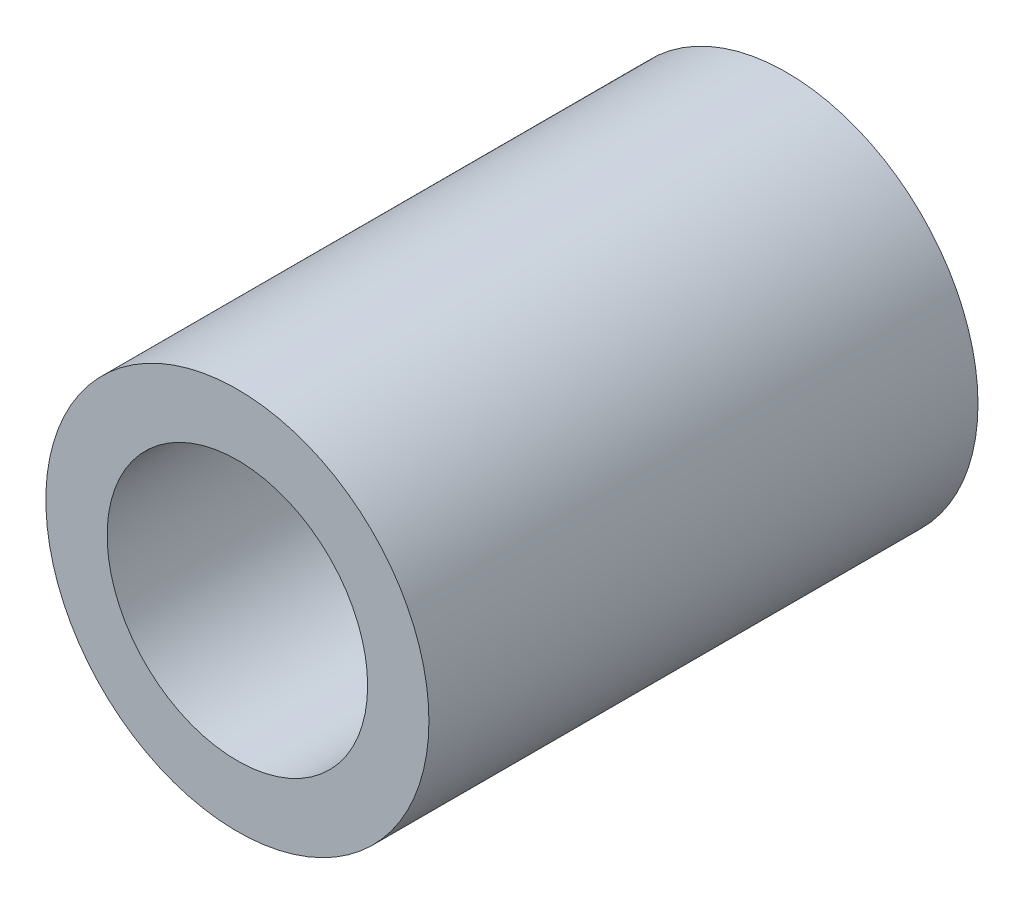
ISO-10303-21;
HEADER;
FILE_DESCRIPTION(('STEP AP214'),'2;1');
FILE_NAME('part.step','',(''),(''),'','','');
FILE_SCHEMA(('AUTOMOTIVE_DESIGN { 1 0 10303 214 1 1 1 1 }'));
ENDSEC;
DATA;
#1=APPLICATION_CONTEXT('core data for automotive mechanical design processes');
#2=APPLICATION_PROTOCOL_DEFINITION('international standard','automotive_design',2000,#1);
#3=PRODUCT_CONTEXT('',#1,'mechanical');
#4=PRODUCT('Part','Part','',(#3));
#5=PRODUCT_RELATED_PRODUCT_CATEGORY('part','',(#4));
#6=PRODUCT_DEFINITION_FORMATION('','',#4);
#7=PRODUCT_DEFINITION_CONTEXT('part definition',#1,'design');
#8=PRODUCT_DEFINITION('design','',#6,#7);
#9=PRODUCT_DEFINITION_SHAPE('','',#8);
#10=(LENGTH_UNIT() NAMED_UNIT(*) SI_UNIT(.MILLI.,.METRE.));
#11=(NAMED_UNIT(*) PLANE_ANGLE_UNIT() SI_UNIT($,.RADIAN.));
#12=(NAMED_UNIT(*) SI_UNIT($,.STERADIAN.) SOLID_ANGLE_UNIT());
#13=UNCERTAINTY_MEASURE_WITH_UNIT(LENGTH_MEASURE(1.E-05),#10,'distance_accuracy_value','');
#14=(GEOMETRIC_REPRESENTATION_CONTEXT(3) GLOBAL_UNCERTAINTY_ASSIGNED_CONTEXT((#13)) GLOBAL_UNIT_ASSIGNED_CONTEXT((#10,
#11,#12)) REPRESENTATION_CONTEXT('',''));
#15=CARTESIAN_POINT('',(0.,0.,0.));
#16=DIRECTION('',(0.,0.,1.));
#17=DIRECTION('',(1.,0.,0.));
#18=AXIS2_PLACEMENT_3D('',#15,#16,#17);
#19=CARTESIAN_POINT('',(0.,0.,21.5));
#20=DIRECTION('',(0.,0.,1.));
#21=DIRECTION('',(1.,0.,0.));
#22=AXIS2_PLACEMENT_3D('',#19,#20,#21);
#23=PLANE('',#22);
#24=CARTESIAN_POINT('',(0.,0.,21.5));
#25=DIRECTION('',(0.,0.,1.));
#26=DIRECTION('',(1.,0.,0.));
#27=AXIS2_PLACEMENT_3D('',#24,#25,#26);
#28=CIRCLE('',#27,7.5);
#29=CARTESIAN_POINT('',(7.5,0.,21.5));
#30=VERTEX_POINT('',#29);
#31=EDGE_CURVE('E10',#30,#30,#28,.T.);
#32=ORIENTED_EDGE('',*,*,#31,.T.);
#33=EDGE_LOOP('',(#32));
#34=FACE_BOUND('',#33,.T.);
#35=CARTESIAN_POINT('',(0.,0.,21.5));
#36=DIRECTION('',(0.,0.,1.));
#37=DIRECTION('',(1.,0.,0.));
#38=AXIS2_PLACEMENT_3D('',#35,#36,#37);
#39=CIRCLE('',#38,5.1);
#40=CARTESIAN_POINT('',(5.1,0.,21.5));
#41=VERTEX_POINT('',#40);
#42=EDGE_CURVE('E44',#41,#41,#39,.T.);
#43=ORIENTED_EDGE('',*,*,#42,.F.);
#44=EDGE_LOOP('',(#43));
#45=FACE_BOUND('',#44,.T.);
#46=ADVANCED_FACE('F33',(#34,#45),#23,.T.);
#47=CARTESIAN_POINT('',(0.,0.,0.));
#48=DIRECTION('',(0.,0.,1.));
#49=DIRECTION('',(1.,0.,0.));
#50=AXIS2_PLACEMENT_3D('',#47,#48,#49);
#51=PLANE('',#50);
#52=CARTESIAN_POINT('',(0.,0.,0.));
#53=DIRECTION('',(0.,0.,1.));
#54=DIRECTION('',(1.,0.,0.));
#55=AXIS2_PLACEMENT_3D('',#52,#53,#54);
#56=CIRCLE('',#55,7.5);
#57=CARTESIAN_POINT('',(7.5,0.,0.));
#58=VERTEX_POINT('',#57);
#59=EDGE_CURVE('E37',#58,#58,#56,.T.);
#60=ORIENTED_EDGE('',*,*,#59,.F.);
#61=EDGE_LOOP('',(#60));
#62=FACE_BOUND('',#61,.T.);
#63=CARTESIAN_POINT('',(0.,0.,0.));
#64=DIRECTION('',(0.,0.,1.));
#65=DIRECTION('',(1.,0.,0.));
#66=AXIS2_PLACEMENT_3D('',#63,#64,#65);
#67=CIRCLE('',#66,5.1);
#68=CARTESIAN_POINT('',(5.1,0.,0.));
#69=VERTEX_POINT('',#68);
#70=EDGE_CURVE('E46',#69,#69,#67,.T.);
#71=ORIENTED_EDGE('',*,*,#70,.T.);
#72=EDGE_LOOP('',(#71));
#73=FACE_BOUND('',#72,.T.);
#74=ADVANCED_FACE('F56',(#62,#73),#51,.F.);
#75=CARTESIAN_POINT('',(0.,0.,21.5));
#76=DIRECTION('',(0.,0.,-1.));
#77=DIRECTION('',(-1.,0.,0.));
#78=AXIS2_PLACEMENT_3D('',#75,#76,#77);
#79=CYLINDRICAL_SURFACE('',#78,7.5);
#80=ORIENTED_EDGE('',*,*,#31,.F.);
#81=EDGE_LOOP('',(#80));
#82=FACE_BOUND('',#81,.T.);
#83=ORIENTED_EDGE('',*,*,#59,.T.);
#84=EDGE_LOOP('',(#83));
#85=FACE_BOUND('',#84,.T.);
#86=ADVANCED_FACE('F35',(#82,#85),#79,.T.);
#87=CARTESIAN_POINT('',(0.,0.,21.5));
#88=DIRECTION('',(0.,0.,-1.));
#89=DIRECTION('',(-1.,0.,0.));
#90=AXIS2_PLACEMENT_3D('',#87,#88,#89);
#91=CYLINDRICAL_SURFACE('',#90,5.1);
#92=ORIENTED_EDGE('',*,*,#42,.T.);
#93=EDGE_LOOP('',(#92));
#94=FACE_BOUND('',#93,.T.);
#95=ORIENTED_EDGE('',*,*,#70,.F.);
#96=EDGE_LOOP('',(#95));
#97=FACE_BOUND('',#96,.T.);
#98=ADVANCED_FACE('F52',(#94,#97),#91,.F.);
#99=CLOSED_SHELL('',(#46,#74,#86,#98));
#100=MANIFOLD_SOLID_BREP('B2',#99);
#101=ADVANCED_BREP_SHAPE_REPRESENTATION('',(#18,#100),#14);
#102=SHAPE_DEFINITION_REPRESENTATION(#9,#101);
ENDSEC;
END-ISO-10303-21;
